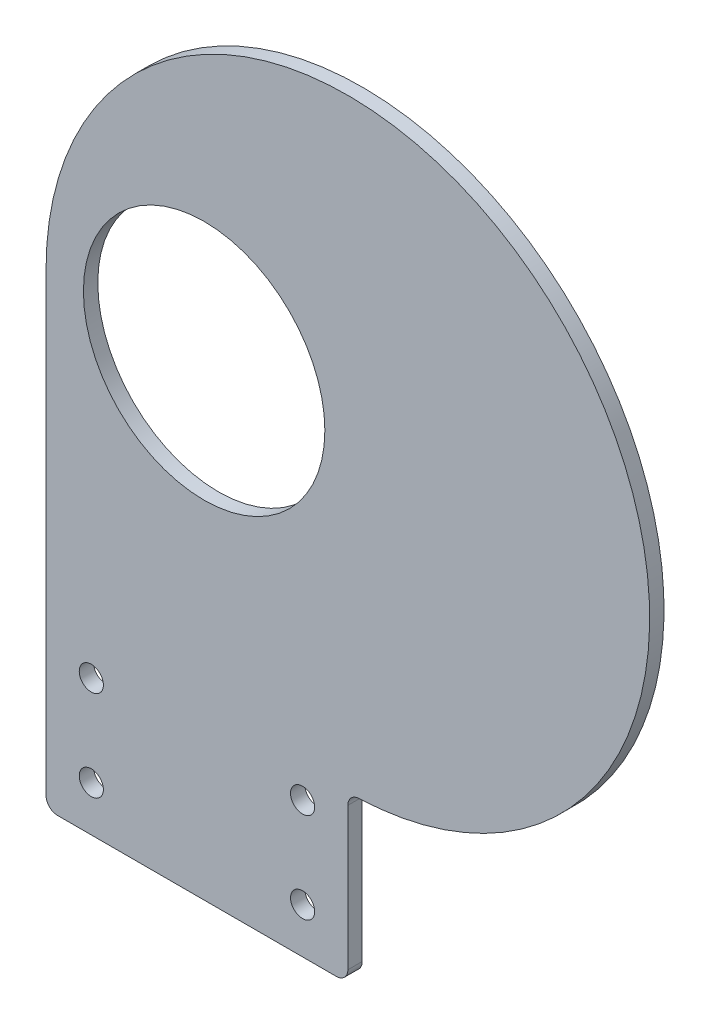
ISO-10303-21;
HEADER;
FILE_DESCRIPTION(('STEP AP214'),'2;1');
FILE_NAME('part.step','',(''),(''),'','','');
FILE_SCHEMA(('AUTOMOTIVE_DESIGN { 1 0 10303 214 1 1 1 1 }'));
ENDSEC;
DATA;
#1=APPLICATION_CONTEXT('core data for automotive mechanical design processes');
#2=APPLICATION_PROTOCOL_DEFINITION('international standard','automotive_design',2000,#1);
#3=PRODUCT_CONTEXT('',#1,'mechanical');
#4=PRODUCT('Part','Part','',(#3));
#5=PRODUCT_RELATED_PRODUCT_CATEGORY('part','',(#4));
#6=PRODUCT_DEFINITION_FORMATION('','',#4);
#7=PRODUCT_DEFINITION_CONTEXT('part definition',#1,'design');
#8=PRODUCT_DEFINITION('design','',#6,#7);
#9=PRODUCT_DEFINITION_SHAPE('','',#8);
#10=(LENGTH_UNIT() NAMED_UNIT(*) SI_UNIT(.MILLI.,.METRE.));
#11=(NAMED_UNIT(*) PLANE_ANGLE_UNIT() SI_UNIT($,.RADIAN.));
#12=(NAMED_UNIT(*) SI_UNIT($,.STERADIAN.) SOLID_ANGLE_UNIT());
#13=UNCERTAINTY_MEASURE_WITH_UNIT(LENGTH_MEASURE(1.E-05),#10,'distance_accuracy_value','');
#14=(GEOMETRIC_REPRESENTATION_CONTEXT(3) GLOBAL_UNCERTAINTY_ASSIGNED_CONTEXT((#13)) GLOBAL_UNIT_ASSIGNED_CONTEXT((#10,
#11,#12)) REPRESENTATION_CONTEXT('',''));
#15=CARTESIAN_POINT('',(0.,0.,0.));
#16=DIRECTION('',(0.,0.,1.));
#17=DIRECTION('',(1.,0.,0.));
#18=AXIS2_PLACEMENT_3D('',#15,#16,#17);
#19=CARTESIAN_POINT('',(31.75,0.,3.175));
#20=DIRECTION('',(0.,0.,1.));
#21=DIRECTION('',(1.,0.,0.));
#22=AXIS2_PLACEMENT_3D('',#19,#20,#21);
#23=PLANE('',#22);
#24=CARTESIAN_POINT('',(21.75,-73.175,3.175));
#25=DIRECTION('',(0.,0.,1.));
#26=DIRECTION('',(1.,0.,0.));
#27=AXIS2_PLACEMENT_3D('',#24,#25,#26);
#28=CIRCLE('',#27,2.665);
#29=CARTESIAN_POINT('',(24.415,-73.175,3.175));
#30=VERTEX_POINT('',#29);
#31=EDGE_CURVE('E316',#30,#30,#28,.F.);
#32=ORIENTED_EDGE('',*,*,#31,.T.);
#33=EDGE_LOOP('',(#32));
#34=FACE_BOUND('',#33,.T.);
#35=CARTESIAN_POINT('',(-24.925,-93.175,3.175));
#36=DIRECTION('',(0.,0.,1.));
#37=DIRECTION('',(1.,0.,0.));
#38=AXIS2_PLACEMENT_3D('',#35,#36,#37);
#39=CIRCLE('',#38,2.665);
#40=CARTESIAN_POINT('',(-22.26,-93.175,3.175));
#41=VERTEX_POINT('',#40);
#42=EDGE_CURVE('E328',#41,#41,#39,.F.);
#43=ORIENTED_EDGE('',*,*,#42,.T.);
#44=EDGE_LOOP('',(#43));
#45=FACE_BOUND('',#44,.T.);
#46=CARTESIAN_POINT('',(-24.925,-73.175,3.175));
#47=DIRECTION('',(0.,0.,1.));
#48=DIRECTION('',(1.,0.,0.));
#49=AXIS2_PLACEMENT_3D('',#46,#47,#48);
#50=CIRCLE('',#49,2.665);
#51=CARTESIAN_POINT('',(-22.26,-73.175,3.175));
#52=VERTEX_POINT('',#51);
#53=EDGE_CURVE('E323',#52,#52,#50,.F.);
#54=ORIENTED_EDGE('',*,*,#53,.T.);
#55=EDGE_LOOP('',(#54));
#56=FACE_BOUND('',#55,.T.);
#57=CARTESIAN_POINT('',(21.75,-93.175,3.175));
#58=DIRECTION('',(0.,0.,1.));
#59=DIRECTION('',(1.,0.,0.));
#60=AXIS2_PLACEMENT_3D('',#57,#58,#59);
#61=CIRCLE('',#60,2.665);
#62=CARTESIAN_POINT('',(24.415,-93.175,3.175));
#63=VERTEX_POINT('',#62);
#64=EDGE_CURVE('E164',#63,#63,#61,.F.);
#65=ORIENTED_EDGE('',*,*,#64,.T.);
#66=EDGE_LOOP('',(#65));
#67=FACE_BOUND('',#66,.T.);
#68=DIRECTION('',(0.,-1.,0.));
#69=VECTOR('',#68,1.);
#70=CARTESIAN_POINT('',(-34.925,0.,3.175));
#71=LINE('',#70,#69);
#72=CARTESIAN_POINT('',(-34.925,0.,3.175));
#73=VERTEX_POINT('',#72);
#74=CARTESIAN_POINT('',(-34.925,-100.635,3.175));
#75=VERTEX_POINT('',#74);
#76=EDGE_CURVE('E96',#73,#75,#71,.T.);
#77=ORIENTED_EDGE('',*,*,#76,.T.);
#78=CARTESIAN_POINT('',(-32.385,-100.635,3.175));
#79=DIRECTION('',(0.,0.,1.));
#80=DIRECTION('',(1.,0.,0.));
#81=AXIS2_PLACEMENT_3D('',#78,#79,#80);
#82=CIRCLE('',#81,2.54);
#83=CARTESIAN_POINT('',(-32.385,-103.175,3.175));
#84=VERTEX_POINT('',#83);
#85=EDGE_CURVE('E137',#75,#84,#82,.T.);
#86=ORIENTED_EDGE('',*,*,#85,.T.);
#87=DIRECTION('',(1.,0.,0.));
#88=VECTOR('',#87,1.);
#89=CARTESIAN_POINT('',(-34.925,-103.175,3.175));
#90=LINE('',#89,#88);
#91=CARTESIAN_POINT('',(29.21,-103.175,3.175));
#92=VERTEX_POINT('',#91);
#93=EDGE_CURVE('E111',#84,#92,#90,.T.);
#94=ORIENTED_EDGE('',*,*,#93,.T.);
#95=CARTESIAN_POINT('',(29.21,-100.635,3.175));
#96=DIRECTION('',(0.,0.,1.));
#97=DIRECTION('',(1.,0.,0.));
#98=AXIS2_PLACEMENT_3D('',#95,#96,#97);
#99=CIRCLE('',#98,2.54);
#100=CARTESIAN_POINT('',(31.75,-100.635,3.175));
#101=VERTEX_POINT('',#100);
#102=EDGE_CURVE('E58',#92,#101,#99,.T.);
#103=ORIENTED_EDGE('',*,*,#102,.T.);
#104=DIRECTION('',(0.,-1.,0.));
#105=VECTOR('',#104,1.);
#106=CARTESIAN_POINT('',(31.75,-66.675,3.175));
#107=LINE('',#106,#105);
#108=CARTESIAN_POINT('',(31.75,-69.1683787940703,3.175));
#109=VERTEX_POINT('',#108);
#110=EDGE_CURVE('E156',#109,#101,#107,.T.);
#111=ORIENTED_EDGE('',*,*,#110,.F.);
#112=CARTESIAN_POINT('',(34.29,-69.1683787940703,3.175));
#113=DIRECTION('',(0.,0.,1.));
#114=DIRECTION('',(1.,0.,0.));
#115=AXIS2_PLACEMENT_3D('',#112,#113,#114);
#116=CIRCLE('',#115,2.54);
#117=CARTESIAN_POINT('',(34.1967889908257,-66.6300896640127,3.175));
#118=VERTEX_POINT('',#117);
#119=EDGE_CURVE('E46',#109,#118,#116,.F.);
#120=ORIENTED_EDGE('',*,*,#119,.T.);
#121=CARTESIAN_POINT('',(31.75,0.,3.175));
#122=DIRECTION('',(0.,0.,1.));
#123=DIRECTION('',(1.,0.,0.));
#124=AXIS2_PLACEMENT_3D('',#121,#122,#123);
#125=CIRCLE('',#124,66.675);
#126=EDGE_CURVE('E92',#118,#73,#125,.T.);
#127=ORIENTED_EDGE('',*,*,#126,.T.);
#128=EDGE_LOOP('',(#77,#86,#94,#103,#111,#120,#127));
#129=FACE_BOUND('',#128,.T.);
#130=CARTESIAN_POINT('',(0.,0.,3.175));
#131=DIRECTION('',(0.,0.,1.));
#132=DIRECTION('',(1.,0.,0.));
#133=AXIS2_PLACEMENT_3D('',#130,#131,#132);
#134=CIRCLE('',#133,26.67);
#135=CARTESIAN_POINT('',(26.67,0.,3.175));
#136=VERTEX_POINT('',#135);
#137=EDGE_CURVE('E122',#136,#136,#134,.T.);
#138=ORIENTED_EDGE('',*,*,#137,.F.);
#139=EDGE_LOOP('',(#138));
#140=FACE_BOUND('',#139,.T.);
#141=ADVANCED_FACE('F38',(#34,#45,#56,#67,#129,#140),#23,.T.);
#142=CARTESIAN_POINT('',(31.75,0.,0.));
#143=DIRECTION('',(0.,0.,1.));
#144=DIRECTION('',(1.,0.,0.));
#145=AXIS2_PLACEMENT_3D('',#142,#143,#144);
#146=PLANE('',#145);
#147=CARTESIAN_POINT('',(21.75,-73.175,0.));
#148=DIRECTION('',(0.,0.,-1.));
#149=DIRECTION('',(1.,0.,0.));
#150=AXIS2_PLACEMENT_3D('',#147,#148,#149);
#151=CIRCLE('',#150,2.665);
#152=CARTESIAN_POINT('',(24.415,-73.175,0.));
#153=VERTEX_POINT('',#152);
#154=EDGE_CURVE('E314',#153,#153,#151,.T.);
#155=ORIENTED_EDGE('',*,*,#154,.F.);
#156=EDGE_LOOP('',(#155));
#157=FACE_BOUND('',#156,.T.);
#158=CARTESIAN_POINT('',(-24.925,-93.175,0.));
#159=DIRECTION('',(0.,0.,-1.));
#160=DIRECTION('',(1.,0.,0.));
#161=AXIS2_PLACEMENT_3D('',#158,#159,#160);
#162=CIRCLE('',#161,2.665);
#163=CARTESIAN_POINT('',(-22.26,-93.175,0.));
#164=VERTEX_POINT('',#163);
#165=EDGE_CURVE('E320',#164,#164,#162,.T.);
#166=ORIENTED_EDGE('',*,*,#165,.F.);
#167=EDGE_LOOP('',(#166));
#168=FACE_BOUND('',#167,.T.);
#169=CARTESIAN_POINT('',(-24.925,-73.175,0.));
#170=DIRECTION('',(0.,0.,-1.));
#171=DIRECTION('',(-1.,0.,0.));
#172=AXIS2_PLACEMENT_3D('',#169,#170,#171);
#173=CIRCLE('',#172,2.665);
#174=CARTESIAN_POINT('',(-27.59,-73.175,0.));
#175=VERTEX_POINT('',#174);
#176=EDGE_CURVE('E330',#175,#175,#173,.T.);
#177=ORIENTED_EDGE('',*,*,#176,.F.);
#178=EDGE_LOOP('',(#177));
#179=FACE_BOUND('',#178,.T.);
#180=CARTESIAN_POINT('',(21.75,-93.175,0.));
#181=DIRECTION('',(0.,0.,-1.));
#182=DIRECTION('',(-1.,0.,0.));
#183=AXIS2_PLACEMENT_3D('',#180,#181,#182);
#184=CIRCLE('',#183,2.665);
#185=CARTESIAN_POINT('',(19.085,-93.175,0.));
#186=VERTEX_POINT('',#185);
#187=EDGE_CURVE('E159',#186,#186,#184,.T.);
#188=ORIENTED_EDGE('',*,*,#187,.F.);
#189=EDGE_LOOP('',(#188));
#190=FACE_BOUND('',#189,.T.);
#191=DIRECTION('',(1.,0.,0.));
#192=VECTOR('',#191,1.);
#193=CARTESIAN_POINT('',(-34.925,-103.175,0.));
#194=LINE('',#193,#192);
#195=CARTESIAN_POINT('',(-32.385,-103.175,0.));
#196=VERTEX_POINT('',#195);
#197=CARTESIAN_POINT('',(29.21,-103.175,0.));
#198=VERTEX_POINT('',#197);
#199=EDGE_CURVE('E100',#196,#198,#194,.T.);
#200=ORIENTED_EDGE('',*,*,#199,.F.);
#201=CARTESIAN_POINT('',(-32.385,-100.635,0.));
#202=DIRECTION('',(0.,0.,1.));
#203=DIRECTION('',(1.,0.,0.));
#204=AXIS2_PLACEMENT_3D('',#201,#202,#203);
#205=CIRCLE('',#204,2.54);
#206=CARTESIAN_POINT('',(-34.925,-100.635,0.));
#207=VERTEX_POINT('',#206);
#208=EDGE_CURVE('E133',#196,#207,#205,.F.);
#209=ORIENTED_EDGE('',*,*,#208,.T.);
#210=DIRECTION('',(0.,-1.,0.));
#211=VECTOR('',#210,1.);
#212=CARTESIAN_POINT('',(-34.925,-63.5,0.));
#213=LINE('',#212,#211);
#214=CARTESIAN_POINT('',(-34.925,0.,0.));
#215=VERTEX_POINT('',#214);
#216=EDGE_CURVE('E121',#215,#207,#213,.T.);
#217=ORIENTED_EDGE('',*,*,#216,.F.);
#218=CARTESIAN_POINT('',(31.75,0.,0.));
#219=DIRECTION('',(0.,0.,1.));
#220=DIRECTION('',(1.,0.,0.));
#221=AXIS2_PLACEMENT_3D('',#218,#219,#220);
#222=CIRCLE('',#221,66.675);
#223=CARTESIAN_POINT('',(34.1967889908257,-66.6300896640127,0.));
#224=VERTEX_POINT('',#223);
#225=EDGE_CURVE('E106',#224,#215,#222,.T.);
#226=ORIENTED_EDGE('',*,*,#225,.F.);
#227=CARTESIAN_POINT('',(34.29,-69.1683787940703,0.));
#228=DIRECTION('',(0.,0.,1.));
#229=DIRECTION('',(1.,0.,0.));
#230=AXIS2_PLACEMENT_3D('',#227,#228,#229);
#231=CIRCLE('',#230,2.54);
#232=CARTESIAN_POINT('',(31.75,-69.1683787940703,0.));
#233=VERTEX_POINT('',#232);
#234=EDGE_CURVE('E11',#224,#233,#231,.T.);
#235=ORIENTED_EDGE('',*,*,#234,.T.);
#236=DIRECTION('',(0.,1.,0.));
#237=VECTOR('',#236,1.);
#238=CARTESIAN_POINT('',(31.75,-66.675,0.));
#239=LINE('',#238,#237);
#240=CARTESIAN_POINT('',(31.75,-100.635,0.));
#241=VERTEX_POINT('',#240);
#242=EDGE_CURVE('E158',#241,#233,#239,.T.);
#243=ORIENTED_EDGE('',*,*,#242,.F.);
#244=CARTESIAN_POINT('',(29.21,-100.635,0.));
#245=DIRECTION('',(0.,0.,1.));
#246=DIRECTION('',(1.,0.,0.));
#247=AXIS2_PLACEMENT_3D('',#244,#245,#246);
#248=CIRCLE('',#247,2.54);
#249=EDGE_CURVE('E131',#241,#198,#248,.F.);
#250=ORIENTED_EDGE('',*,*,#249,.T.);
#251=EDGE_LOOP('',(#200,#209,#217,#226,#235,#243,#250));
#252=FACE_BOUND('',#251,.T.);
#253=CARTESIAN_POINT('',(0.,0.,0.));
#254=DIRECTION('',(0.,0.,1.));
#255=DIRECTION('',(1.,0.,0.));
#256=AXIS2_PLACEMENT_3D('',#253,#254,#255);
#257=CIRCLE('',#256,26.67);
#258=CARTESIAN_POINT('',(26.67,0.,0.));
#259=VERTEX_POINT('',#258);
#260=EDGE_CURVE('E161',#259,#259,#257,.T.);
#261=ORIENTED_EDGE('',*,*,#260,.T.);
#262=EDGE_LOOP('',(#261));
#263=FACE_BOUND('',#262,.T.);
#264=ADVANCED_FACE('F149',(#157,#168,#179,#190,#252,#263),#146,.F.);
#265=CARTESIAN_POINT('',(31.75,0.,3.175));
#266=DIRECTION('',(0.,0.,-1.));
#267=DIRECTION('',(-1.,0.,0.));
#268=AXIS2_PLACEMENT_3D('',#265,#266,#267);
#269=CYLINDRICAL_SURFACE('',#268,66.675);
#270=ORIENTED_EDGE('',*,*,#126,.F.);
#271=DIRECTION('',(0.,0.,-1.));
#272=VECTOR('',#271,1.);
#273=CARTESIAN_POINT('',(34.1967889908257,-66.6300896640127,3.175));
#274=LINE('',#273,#272);
#275=EDGE_CURVE('E144',#118,#224,#274,.T.);
#276=ORIENTED_EDGE('',*,*,#275,.T.);
#277=ORIENTED_EDGE('',*,*,#225,.T.);
#278=DIRECTION('',(0.,0.,-1.));
#279=VECTOR('',#278,1.);
#280=CARTESIAN_POINT('',(-34.925,0.,3.175));
#281=LINE('',#280,#279);
#282=EDGE_CURVE('E103',#73,#215,#281,.T.);
#283=ORIENTED_EDGE('',*,*,#282,.F.);
#284=EDGE_LOOP('',(#270,#276,#277,#283));
#285=FACE_BOUND('',#284,.T.);
#286=ADVANCED_FACE('F104',(#285),#269,.T.);
#287=CARTESIAN_POINT('',(-34.925,-63.5,3.175));
#288=DIRECTION('',(1.,0.,0.));
#289=DIRECTION('',(0.,1.,0.));
#290=AXIS2_PLACEMENT_3D('',#287,#288,#289);
#291=PLANE('',#290);
#292=ORIENTED_EDGE('',*,*,#216,.T.);
#293=DIRECTION('',(0.,0.,-1.));
#294=VECTOR('',#293,1.);
#295=CARTESIAN_POINT('',(-34.925,-100.635,3.175));
#296=LINE('',#295,#294);
#297=EDGE_CURVE('E115',#207,#75,#296,.F.);
#298=ORIENTED_EDGE('',*,*,#297,.T.);
#299=ORIENTED_EDGE('',*,*,#76,.F.);
#300=ORIENTED_EDGE('',*,*,#282,.T.);
#301=EDGE_LOOP('',(#292,#298,#299,#300));
#302=FACE_BOUND('',#301,.T.);
#303=ADVANCED_FACE('F113',(#302),#291,.F.);
#304=CARTESIAN_POINT('',(-34.925,-103.175,3.175));
#305=DIRECTION('',(0.,1.,0.));
#306=DIRECTION('',(0.,0.,1.));
#307=AXIS2_PLACEMENT_3D('',#304,#305,#306);
#308=PLANE('',#307);
#309=ORIENTED_EDGE('',*,*,#93,.F.);
#310=DIRECTION('',(0.,0.,-1.));
#311=VECTOR('',#310,1.);
#312=CARTESIAN_POINT('',(-32.385,-103.175,3.175));
#313=LINE('',#312,#311);
#314=EDGE_CURVE('E128',#84,#196,#313,.T.);
#315=ORIENTED_EDGE('',*,*,#314,.T.);
#316=ORIENTED_EDGE('',*,*,#199,.T.);
#317=DIRECTION('',(0.,0.,1.));
#318=VECTOR('',#317,1.);
#319=CARTESIAN_POINT('',(29.21,-103.175,3.175));
#320=LINE('',#319,#318);
#321=EDGE_CURVE('E110',#198,#92,#320,.T.);
#322=ORIENTED_EDGE('',*,*,#321,.T.);
#323=EDGE_LOOP('',(#309,#315,#316,#322));
#324=FACE_BOUND('',#323,.T.);
#325=ADVANCED_FACE('F174',(#324),#308,.F.);
#326=CARTESIAN_POINT('',(0.,0.,3.175));
#327=DIRECTION('',(0.,0.,-1.));
#328=DIRECTION('',(-1.,0.,0.));
#329=AXIS2_PLACEMENT_3D('',#326,#327,#328);
#330=CYLINDRICAL_SURFACE('',#329,26.67);
#331=ORIENTED_EDGE('',*,*,#137,.T.);
#332=EDGE_LOOP('',(#331));
#333=FACE_BOUND('',#332,.T.);
#334=ORIENTED_EDGE('',*,*,#260,.F.);
#335=EDGE_LOOP('',(#334));
#336=FACE_BOUND('',#335,.T.);
#337=ADVANCED_FACE('F172',(#333,#336),#330,.F.);
#338=CARTESIAN_POINT('',(31.75,-66.675,-0.00100000000000013));
#339=DIRECTION('',(-1.,0.,0.));
#340=DIRECTION('',(0.,0.,1.));
#341=AXIS2_PLACEMENT_3D('',#338,#339,#340);
#342=PLANE('',#341);
#343=ORIENTED_EDGE('',*,*,#110,.T.);
#344=DIRECTION('',(0.,0.,1.));
#345=VECTOR('',#344,1.);
#346=CARTESIAN_POINT('',(31.75,-100.635,-0.00100000000000013));
#347=LINE('',#346,#345);
#348=EDGE_CURVE('E142',#101,#241,#347,.F.);
#349=ORIENTED_EDGE('',*,*,#348,.T.);
#350=ORIENTED_EDGE('',*,*,#242,.T.);
#351=DIRECTION('',(0.,0.,1.));
#352=VECTOR('',#351,1.);
#353=CARTESIAN_POINT('',(31.75,-69.1683787940703,3.175));
#354=LINE('',#353,#352);
#355=EDGE_CURVE('E139',#233,#109,#354,.T.);
#356=ORIENTED_EDGE('',*,*,#355,.T.);
#357=EDGE_LOOP('',(#343,#349,#350,#356));
#358=FACE_BOUND('',#357,.T.);
#359=ADVANCED_FACE('F155',(#358),#342,.F.);
#360=CARTESIAN_POINT('',(21.75,-93.175,3.176));
#361=DIRECTION('',(0.,0.,-1.));
#362=DIRECTION('',(-1.,0.,0.));
#363=AXIS2_PLACEMENT_3D('',#360,#361,#362);
#364=CYLINDRICAL_SURFACE('',#363,2.665);
#365=ORIENTED_EDGE('',*,*,#64,.F.);
#366=EDGE_LOOP('',(#365));
#367=FACE_BOUND('',#366,.T.);
#368=ORIENTED_EDGE('',*,*,#187,.T.);
#369=EDGE_LOOP('',(#368));
#370=FACE_BOUND('',#369,.T.);
#371=ADVANCED_FACE('F181',(#367,#370),#364,.F.);
#372=CARTESIAN_POINT('',(-24.925,-73.175,3.176));
#373=DIRECTION('',(0.,0.,-1.));
#374=DIRECTION('',(-1.,0.,0.));
#375=AXIS2_PLACEMENT_3D('',#372,#373,#374);
#376=CYLINDRICAL_SURFACE('',#375,2.665);
#377=ORIENTED_EDGE('',*,*,#53,.F.);
#378=EDGE_LOOP('',(#377));
#379=FACE_BOUND('',#378,.T.);
#380=ORIENTED_EDGE('',*,*,#176,.T.);
#381=EDGE_LOOP('',(#380));
#382=FACE_BOUND('',#381,.T.);
#383=ADVANCED_FACE('F284',(#379,#382),#376,.F.);
#384=CARTESIAN_POINT('',(-24.925,-93.175,3.176));
#385=DIRECTION('',(0.,0.,-1.));
#386=DIRECTION('',(-1.,0.,0.));
#387=AXIS2_PLACEMENT_3D('',#384,#385,#386);
#388=CYLINDRICAL_SURFACE('',#387,2.665);
#389=ORIENTED_EDGE('',*,*,#42,.F.);
#390=EDGE_LOOP('',(#389));
#391=FACE_BOUND('',#390,.T.);
#392=ORIENTED_EDGE('',*,*,#165,.T.);
#393=EDGE_LOOP('',(#392));
#394=FACE_BOUND('',#393,.T.);
#395=ADVANCED_FACE('F274',(#391,#394),#388,.F.);
#396=CARTESIAN_POINT('',(21.75,-73.175,3.176));
#397=DIRECTION('',(0.,0.,-1.));
#398=DIRECTION('',(-1.,0.,0.));
#399=AXIS2_PLACEMENT_3D('',#396,#397,#398);
#400=CYLINDRICAL_SURFACE('',#399,2.665);
#401=ORIENTED_EDGE('',*,*,#31,.F.);
#402=EDGE_LOOP('',(#401));
#403=FACE_BOUND('',#402,.T.);
#404=ORIENTED_EDGE('',*,*,#154,.T.);
#405=EDGE_LOOP('',(#404));
#406=FACE_BOUND('',#405,.T.);
#407=ADVANCED_FACE('F203',(#403,#406),#400,.F.);
#408=CARTESIAN_POINT('',(-32.385,-100.635,3.175));
#409=DIRECTION('',(0.,0.,-1.));
#410=DIRECTION('',(-1.,0.,0.));
#411=AXIS2_PLACEMENT_3D('',#408,#409,#410);
#412=CYLINDRICAL_SURFACE('',#411,2.54);
#413=ORIENTED_EDGE('',*,*,#85,.F.);
#414=ORIENTED_EDGE('',*,*,#297,.F.);
#415=ORIENTED_EDGE('',*,*,#208,.F.);
#416=ORIENTED_EDGE('',*,*,#314,.F.);
#417=EDGE_LOOP('',(#413,#414,#415,#416));
#418=FACE_BOUND('',#417,.T.);
#419=ADVANCED_FACE('F200',(#418),#412,.T.);
#420=CARTESIAN_POINT('',(29.21,-100.635,3.175));
#421=DIRECTION('',(0.,0.,1.));
#422=DIRECTION('',(1.,0.,0.));
#423=AXIS2_PLACEMENT_3D('',#420,#421,#422);
#424=CYLINDRICAL_SURFACE('',#423,2.54);
#425=ORIENTED_EDGE('',*,*,#249,.F.);
#426=ORIENTED_EDGE('',*,*,#348,.F.);
#427=ORIENTED_EDGE('',*,*,#102,.F.);
#428=ORIENTED_EDGE('',*,*,#321,.F.);
#429=EDGE_LOOP('',(#425,#426,#427,#428));
#430=FACE_BOUND('',#429,.T.);
#431=ADVANCED_FACE('F202',(#430),#424,.T.);
#432=CARTESIAN_POINT('',(34.29,-69.1683787940703,3.175));
#433=DIRECTION('',(0.,0.,-1.));
#434=DIRECTION('',(-1.,0.,0.));
#435=AXIS2_PLACEMENT_3D('',#432,#433,#434);
#436=CYLINDRICAL_SURFACE('',#435,2.54);
#437=ORIENTED_EDGE('',*,*,#234,.F.);
#438=ORIENTED_EDGE('',*,*,#275,.F.);
#439=ORIENTED_EDGE('',*,*,#119,.F.);
#440=ORIENTED_EDGE('',*,*,#355,.F.);
#441=EDGE_LOOP('',(#437,#438,#439,#440));
#442=FACE_BOUND('',#441,.T.);
#443=ADVANCED_FACE('F40',(#442),#436,.F.);
#444=CLOSED_SHELL('',(#141,#264,#286,#303,#325,#337,#359,#371,#383,#395,#407,#419,#431,#443));
#445=MANIFOLD_SOLID_BREP('B2',#444);
#446=ADVANCED_BREP_SHAPE_REPRESENTATION('',(#18,#445),#14);
#447=SHAPE_DEFINITION_REPRESENTATION(#9,#446);
ENDSEC;
END-ISO-10303-21;
